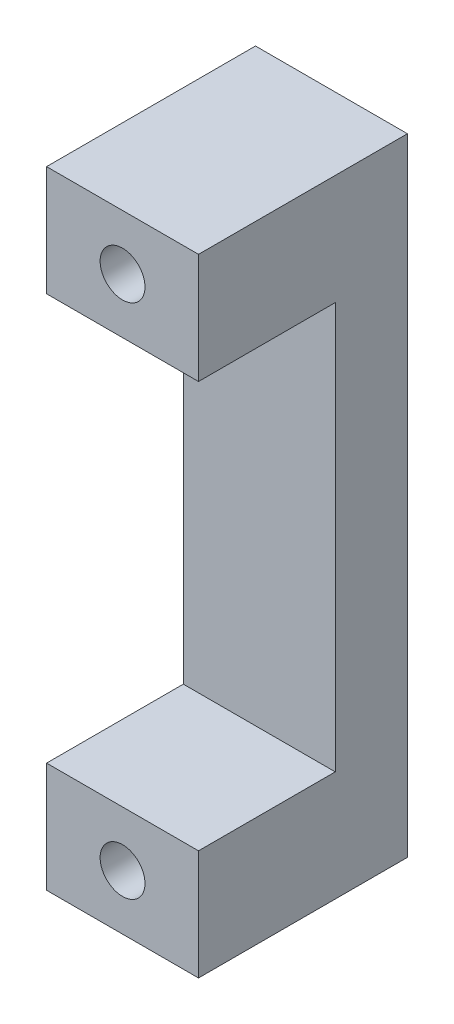
ISO-10303-21;
HEADER;
FILE_DESCRIPTION(('STEP AP214'),'2;1');
FILE_NAME('part.step','',(''),(''),'','','');
FILE_SCHEMA(('AUTOMOTIVE_DESIGN { 1 0 10303 214 1 1 1 1 }'));
ENDSEC;
DATA;
#1=APPLICATION_CONTEXT('core data for automotive mechanical design processes');
#2=APPLICATION_PROTOCOL_DEFINITION('international standard','automotive_design',2000,#1);
#3=PRODUCT_CONTEXT('',#1,'mechanical');
#4=PRODUCT('Part','Part','',(#3));
#5=PRODUCT_RELATED_PRODUCT_CATEGORY('part','',(#4));
#6=PRODUCT_DEFINITION_FORMATION('','',#4);
#7=PRODUCT_DEFINITION_CONTEXT('part definition',#1,'design');
#8=PRODUCT_DEFINITION('design','',#6,#7);
#9=PRODUCT_DEFINITION_SHAPE('','',#8);
#10=(LENGTH_UNIT() NAMED_UNIT(*) SI_UNIT(.MILLI.,.METRE.));
#11=(NAMED_UNIT(*) PLANE_ANGLE_UNIT() SI_UNIT($,.RADIAN.));
#12=(NAMED_UNIT(*) SI_UNIT($,.STERADIAN.) SOLID_ANGLE_UNIT());
#13=UNCERTAINTY_MEASURE_WITH_UNIT(LENGTH_MEASURE(1.E-05),#10,'distance_accuracy_value','');
#14=(GEOMETRIC_REPRESENTATION_CONTEXT(3) GLOBAL_UNCERTAINTY_ASSIGNED_CONTEXT((#13)) GLOBAL_UNIT_ASSIGNED_CONTEXT((#10,
#11,#12)) REPRESENTATION_CONTEXT('',''));
#15=CARTESIAN_POINT('',(0.,0.,0.));
#16=DIRECTION('',(0.,0.,1.));
#17=DIRECTION('',(1.,0.,0.));
#18=AXIS2_PLACEMENT_3D('',#15,#16,#17);
#19=CARTESIAN_POINT('',(0.,0.,13.97));
#20=DIRECTION('',(0.,0.,-1.));
#21=DIRECTION('',(-1.,0.,0.));
#22=AXIS2_PLACEMENT_3D('',#19,#20,#21);
#23=PLANE('',#22);
#24=CARTESIAN_POINT('',(5.08,38.227,13.97));
#25=DIRECTION('',(0.,0.,1.));
#26=DIRECTION('',(1.,0.,0.));
#27=AXIS2_PLACEMENT_3D('',#24,#25,#26);
#28=CIRCLE('',#27,1.49999999999999);
#29=CARTESIAN_POINT('',(6.57999999999999,38.227,13.97));
#30=VERTEX_POINT('',#29);
#31=EDGE_CURVE('E210',#30,#30,#28,.T.);
#32=ORIENTED_EDGE('',*,*,#31,.F.);
#33=EDGE_LOOP('',(#32));
#34=FACE_BOUND('',#33,.T.);
#35=DIRECTION('',(0.,-1.,0.));
#36=VECTOR('',#35,1.);
#37=CARTESIAN_POINT('',(0.,0.,13.97));
#38=LINE('',#37,#36);
#39=CARTESIAN_POINT('',(0.,41.91,13.97));
#40=VERTEX_POINT('',#39);
#41=CARTESIAN_POINT('',(0.,34.544,13.97));
#42=VERTEX_POINT('',#41);
#43=EDGE_CURVE('E144',#40,#42,#38,.T.);
#44=ORIENTED_EDGE('',*,*,#43,.T.);
#45=DIRECTION('',(-1.,0.,0.));
#46=VECTOR('',#45,1.);
#47=CARTESIAN_POINT('',(0.,34.544,13.97));
#48=LINE('',#47,#46);
#49=CARTESIAN_POINT('',(10.16,34.544,13.97));
#50=VERTEX_POINT('',#49);
#51=EDGE_CURVE('E132',#50,#42,#48,.T.);
#52=ORIENTED_EDGE('',*,*,#51,.F.);
#53=DIRECTION('',(0.,1.,0.));
#54=VECTOR('',#53,1.);
#55=CARTESIAN_POINT('',(10.16,0.,13.97));
#56=LINE('',#55,#54);
#57=CARTESIAN_POINT('',(10.16,41.91,13.97));
#58=VERTEX_POINT('',#57);
#59=EDGE_CURVE('E150',#50,#58,#56,.T.);
#60=ORIENTED_EDGE('',*,*,#59,.T.);
#61=DIRECTION('',(-1.,0.,0.));
#62=VECTOR('',#61,1.);
#63=CARTESIAN_POINT('',(0.,41.91,13.97));
#64=LINE('',#63,#62);
#65=EDGE_CURVE('E64',#58,#40,#64,.T.);
#66=ORIENTED_EDGE('',*,*,#65,.T.);
#67=EDGE_LOOP('',(#44,#52,#60,#66));
#68=FACE_BOUND('',#67,.T.);
#69=ADVANCED_FACE('F39',(#34,#68),#23,.F.);
#70=CARTESIAN_POINT('',(0.,0.,13.97));
#71=DIRECTION('',(1.,0.,0.));
#72=DIRECTION('',(0.,1.,0.));
#73=AXIS2_PLACEMENT_3D('',#70,#71,#72);
#74=PLANE('',#73);
#75=DIRECTION('',(0.,-1.,0.));
#76=VECTOR('',#75,1.);
#77=CARTESIAN_POINT('',(0.,34.544,4.826));
#78=LINE('',#77,#76);
#79=CARTESIAN_POINT('',(0.,34.544,4.826));
#80=VERTEX_POINT('',#79);
#81=CARTESIAN_POINT('',(0.,7.366,4.826));
#82=VERTEX_POINT('',#81);
#83=EDGE_CURVE('E122',#80,#82,#78,.T.);
#84=ORIENTED_EDGE('',*,*,#83,.F.);
#85=DIRECTION('',(0.,0.,1.));
#86=VECTOR('',#85,1.);
#87=CARTESIAN_POINT('',(0.,34.544,4.826));
#88=LINE('',#87,#86);
#89=EDGE_CURVE('E163',#80,#42,#88,.T.);
#90=ORIENTED_EDGE('',*,*,#89,.T.);
#91=ORIENTED_EDGE('',*,*,#43,.F.);
#92=DIRECTION('',(0.,0.,-1.));
#93=VECTOR('',#92,1.);
#94=CARTESIAN_POINT('',(0.,41.91,13.97));
#95=LINE('',#94,#93);
#96=CARTESIAN_POINT('',(0.,41.91,0.));
#97=VERTEX_POINT('',#96);
#98=EDGE_CURVE('E157',#40,#97,#95,.T.);
#99=ORIENTED_EDGE('',*,*,#98,.T.);
#100=DIRECTION('',(0.,-1.,0.));
#101=VECTOR('',#100,1.);
#102=CARTESIAN_POINT('',(0.,0.,0.));
#103=LINE('',#102,#101);
#104=CARTESIAN_POINT('',(0.,0.,0.));
#105=VERTEX_POINT('',#104);
#106=EDGE_CURVE('E158',#97,#105,#103,.T.);
#107=ORIENTED_EDGE('',*,*,#106,.T.);
#108=DIRECTION('',(0.,0.,-1.));
#109=VECTOR('',#108,1.);
#110=CARTESIAN_POINT('',(0.,0.,13.97));
#111=LINE('',#110,#109);
#112=CARTESIAN_POINT('',(0.,0.,13.97));
#113=VERTEX_POINT('',#112);
#114=EDGE_CURVE('E11',#113,#105,#111,.T.);
#115=ORIENTED_EDGE('',*,*,#114,.F.);
#116=CARTESIAN_POINT('',(0.,7.366,13.97));
#117=VERTEX_POINT('',#116);
#118=EDGE_CURVE('E92',#117,#113,#38,.T.);
#119=ORIENTED_EDGE('',*,*,#118,.F.);
#120=DIRECTION('',(0.,0.,1.));
#121=VECTOR('',#120,1.);
#122=CARTESIAN_POINT('',(0.,7.366,4.826));
#123=LINE('',#122,#121);
#124=EDGE_CURVE('E55',#82,#117,#123,.T.);
#125=ORIENTED_EDGE('',*,*,#124,.F.);
#126=EDGE_LOOP('',(#84,#90,#91,#99,#107,#115,#119,#125));
#127=FACE_BOUND('',#126,.T.);
#128=ADVANCED_FACE('F41',(#127),#74,.F.);
#129=CARTESIAN_POINT('',(0.,0.,13.97));
#130=DIRECTION('',(0.,1.,0.));
#131=DIRECTION('',(0.,0.,1.));
#132=AXIS2_PLACEMENT_3D('',#129,#130,#131);
#133=PLANE('',#132);
#134=DIRECTION('',(1.,0.,0.));
#135=VECTOR('',#134,1.);
#136=CARTESIAN_POINT('',(0.,0.,0.));
#137=LINE('',#136,#135);
#138=CARTESIAN_POINT('',(10.16,0.,0.));
#139=VERTEX_POINT('',#138);
#140=EDGE_CURVE('E162',#105,#139,#137,.T.);
#141=ORIENTED_EDGE('',*,*,#140,.T.);
#142=DIRECTION('',(0.,0.,-1.));
#143=VECTOR('',#142,1.);
#144=CARTESIAN_POINT('',(10.16,0.,13.97));
#145=LINE('',#144,#143);
#146=CARTESIAN_POINT('',(10.16,0.,13.97));
#147=VERTEX_POINT('',#146);
#148=EDGE_CURVE('E48',#147,#139,#145,.T.);
#149=ORIENTED_EDGE('',*,*,#148,.F.);
#150=DIRECTION('',(1.,0.,0.));
#151=VECTOR('',#150,1.);
#152=CARTESIAN_POINT('',(0.,0.,13.97));
#153=LINE('',#152,#151);
#154=EDGE_CURVE('E147',#113,#147,#153,.T.);
#155=ORIENTED_EDGE('',*,*,#154,.F.);
#156=ORIENTED_EDGE('',*,*,#114,.T.);
#157=EDGE_LOOP('',(#141,#149,#155,#156));
#158=FACE_BOUND('',#157,.T.);
#159=ADVANCED_FACE('F229',(#158),#133,.F.);
#160=CARTESIAN_POINT('',(10.16,0.,13.97));
#161=DIRECTION('',(-1.,0.,0.));
#162=DIRECTION('',(0.,-1.,0.));
#163=AXIS2_PLACEMENT_3D('',#160,#161,#162);
#164=PLANE('',#163);
#165=ORIENTED_EDGE('',*,*,#59,.F.);
#166=DIRECTION('',(0.,0.,1.));
#167=VECTOR('',#166,1.);
#168=CARTESIAN_POINT('',(10.16,34.544,4.826));
#169=LINE('',#168,#167);
#170=CARTESIAN_POINT('',(10.16,34.544,4.826));
#171=VERTEX_POINT('',#170);
#172=EDGE_CURVE('E139',#171,#50,#169,.T.);
#173=ORIENTED_EDGE('',*,*,#172,.F.);
#174=DIRECTION('',(0.,1.,0.));
#175=VECTOR('',#174,1.);
#176=CARTESIAN_POINT('',(10.16,34.544,4.826));
#177=LINE('',#176,#175);
#178=CARTESIAN_POINT('',(10.16,7.366,4.826));
#179=VERTEX_POINT('',#178);
#180=EDGE_CURVE('E121',#179,#171,#177,.T.);
#181=ORIENTED_EDGE('',*,*,#180,.F.);
#182=DIRECTION('',(0.,0.,1.));
#183=VECTOR('',#182,1.);
#184=CARTESIAN_POINT('',(10.16,7.366,4.826));
#185=LINE('',#184,#183);
#186=CARTESIAN_POINT('',(10.16,7.366,13.97));
#187=VERTEX_POINT('',#186);
#188=EDGE_CURVE('E117',#179,#187,#185,.T.);
#189=ORIENTED_EDGE('',*,*,#188,.T.);
#190=EDGE_CURVE('E151',#147,#187,#56,.T.);
#191=ORIENTED_EDGE('',*,*,#190,.F.);
#192=ORIENTED_EDGE('',*,*,#148,.T.);
#193=DIRECTION('',(0.,1.,0.));
#194=VECTOR('',#193,1.);
#195=CARTESIAN_POINT('',(10.16,0.,0.));
#196=LINE('',#195,#194);
#197=CARTESIAN_POINT('',(10.16,41.91,0.));
#198=VERTEX_POINT('',#197);
#199=EDGE_CURVE('E166',#139,#198,#196,.T.);
#200=ORIENTED_EDGE('',*,*,#199,.T.);
#201=DIRECTION('',(0.,0.,-1.));
#202=VECTOR('',#201,1.);
#203=CARTESIAN_POINT('',(10.16,41.91,13.97));
#204=LINE('',#203,#202);
#205=EDGE_CURVE('E173',#58,#198,#204,.T.);
#206=ORIENTED_EDGE('',*,*,#205,.F.);
#207=EDGE_LOOP('',(#165,#173,#181,#189,#191,#192,#200,#206));
#208=FACE_BOUND('',#207,.T.);
#209=ADVANCED_FACE('F182',(#208),#164,.F.);
#210=CARTESIAN_POINT('',(0.,41.91,13.97));
#211=DIRECTION('',(0.,-1.,0.));
#212=DIRECTION('',(0.,0.,-1.));
#213=AXIS2_PLACEMENT_3D('',#210,#211,#212);
#214=PLANE('',#213);
#215=DIRECTION('',(-1.,0.,0.));
#216=VECTOR('',#215,1.);
#217=CARTESIAN_POINT('',(0.,41.91,0.));
#218=LINE('',#217,#216);
#219=EDGE_CURVE('E85',#198,#97,#218,.T.);
#220=ORIENTED_EDGE('',*,*,#219,.T.);
#221=ORIENTED_EDGE('',*,*,#98,.F.);
#222=ORIENTED_EDGE('',*,*,#65,.F.);
#223=ORIENTED_EDGE('',*,*,#205,.T.);
#224=EDGE_LOOP('',(#220,#221,#222,#223));
#225=FACE_BOUND('',#224,.T.);
#226=ADVANCED_FACE('F189',(#225),#214,.F.);
#227=CARTESIAN_POINT('',(5.08,3.683,13.97));
#228=DIRECTION('',(0.,0.,1.));
#229=DIRECTION('',(1.,0.,0.));
#230=AXIS2_PLACEMENT_3D('',#227,#228,#229);
#231=CIRCLE('',#230,1.49999999999999);
#232=CARTESIAN_POINT('',(6.57999999999999,3.683,13.97));
#233=VERTEX_POINT('',#232);
#234=EDGE_CURVE('E218',#233,#233,#231,.T.);
#235=ORIENTED_EDGE('',*,*,#234,.F.);
#236=EDGE_LOOP('',(#235));
#237=FACE_BOUND('',#236,.T.);
#238=ORIENTED_EDGE('',*,*,#190,.T.);
#239=DIRECTION('',(1.,0.,0.));
#240=VECTOR('',#239,1.);
#241=CARTESIAN_POINT('',(0.,7.366,13.97));
#242=LINE('',#241,#240);
#243=EDGE_CURVE('E201',#117,#187,#242,.T.);
#244=ORIENTED_EDGE('',*,*,#243,.F.);
#245=ORIENTED_EDGE('',*,*,#118,.T.);
#246=ORIENTED_EDGE('',*,*,#154,.T.);
#247=EDGE_LOOP('',(#238,#244,#245,#246));
#248=FACE_BOUND('',#247,.T.);
#249=ADVANCED_FACE('F226',(#237,#248),#23,.F.);
#250=CARTESIAN_POINT('',(0.,0.,0.));
#251=DIRECTION('',(0.,0.,-1.));
#252=DIRECTION('',(-1.,0.,0.));
#253=AXIS2_PLACEMENT_3D('',#250,#251,#252);
#254=PLANE('',#253);
#255=CARTESIAN_POINT('',(5.08,3.683,0.));
#256=DIRECTION('',(0.,0.,-1.));
#257=DIRECTION('',(-1.,0.,0.));
#258=AXIS2_PLACEMENT_3D('',#255,#256,#257);
#259=CIRCLE('',#258,1.49999999999999);
#260=CARTESIAN_POINT('',(3.58000000000001,3.683,0.));
#261=VERTEX_POINT('',#260);
#262=EDGE_CURVE('E214',#261,#261,#259,.T.);
#263=ORIENTED_EDGE('',*,*,#262,.F.);
#264=EDGE_LOOP('',(#263));
#265=FACE_BOUND('',#264,.T.);
#266=CARTESIAN_POINT('',(5.08,38.227,0.));
#267=DIRECTION('',(0.,0.,-1.));
#268=DIRECTION('',(-1.,0.,0.));
#269=AXIS2_PLACEMENT_3D('',#266,#267,#268);
#270=CIRCLE('',#269,1.49999999999999);
#271=CARTESIAN_POINT('',(3.58000000000001,38.227,0.));
#272=VERTEX_POINT('',#271);
#273=EDGE_CURVE('E203',#272,#272,#270,.T.);
#274=ORIENTED_EDGE('',*,*,#273,.F.);
#275=EDGE_LOOP('',(#274));
#276=FACE_BOUND('',#275,.T.);
#277=ORIENTED_EDGE('',*,*,#106,.F.);
#278=ORIENTED_EDGE('',*,*,#219,.F.);
#279=ORIENTED_EDGE('',*,*,#199,.F.);
#280=ORIENTED_EDGE('',*,*,#140,.F.);
#281=EDGE_LOOP('',(#277,#278,#279,#280));
#282=FACE_BOUND('',#281,.T.);
#283=ADVANCED_FACE('F187',(#265,#276,#282),#254,.T.);
#284=CARTESIAN_POINT('',(0.,34.544,4.826));
#285=DIRECTION('',(0.,1.,0.));
#286=DIRECTION('',(0.,0.,1.));
#287=AXIS2_PLACEMENT_3D('',#284,#285,#286);
#288=PLANE('',#287);
#289=ORIENTED_EDGE('',*,*,#51,.T.);
#290=ORIENTED_EDGE('',*,*,#89,.F.);
#291=DIRECTION('',(-1.,0.,0.));
#292=VECTOR('',#291,1.);
#293=CARTESIAN_POINT('',(0.,34.544,4.826));
#294=LINE('',#293,#292);
#295=EDGE_CURVE('E128',#171,#80,#294,.T.);
#296=ORIENTED_EDGE('',*,*,#295,.F.);
#297=ORIENTED_EDGE('',*,*,#172,.T.);
#298=EDGE_LOOP('',(#289,#290,#296,#297));
#299=FACE_BOUND('',#298,.T.);
#300=ADVANCED_FACE('F246',(#299),#288,.F.);
#301=CARTESIAN_POINT('',(0.,7.366,4.826));
#302=DIRECTION('',(0.,-1.,0.));
#303=DIRECTION('',(0.,0.,-1.));
#304=AXIS2_PLACEMENT_3D('',#301,#302,#303);
#305=PLANE('',#304);
#306=ORIENTED_EDGE('',*,*,#243,.T.);
#307=ORIENTED_EDGE('',*,*,#188,.F.);
#308=DIRECTION('',(1.,0.,0.));
#309=VECTOR('',#308,1.);
#310=CARTESIAN_POINT('',(0.,7.366,4.826));
#311=LINE('',#310,#309);
#312=EDGE_CURVE('E113',#82,#179,#311,.T.);
#313=ORIENTED_EDGE('',*,*,#312,.F.);
#314=ORIENTED_EDGE('',*,*,#124,.T.);
#315=EDGE_LOOP('',(#306,#307,#313,#314));
#316=FACE_BOUND('',#315,.T.);
#317=ADVANCED_FACE('F115',(#316),#305,.F.);
#318=CARTESIAN_POINT('',(0.,0.,4.826));
#319=DIRECTION('',(0.,0.,1.));
#320=DIRECTION('',(1.,0.,0.));
#321=AXIS2_PLACEMENT_3D('',#318,#319,#320);
#322=PLANE('',#321);
#323=ORIENTED_EDGE('',*,*,#83,.T.);
#324=ORIENTED_EDGE('',*,*,#312,.T.);
#325=ORIENTED_EDGE('',*,*,#180,.T.);
#326=ORIENTED_EDGE('',*,*,#295,.T.);
#327=EDGE_LOOP('',(#323,#324,#325,#326));
#328=FACE_BOUND('',#327,.T.);
#329=ADVANCED_FACE('F126',(#328),#322,.T.);
#330=CARTESIAN_POINT('',(5.08,38.227,13.97));
#331=DIRECTION('',(0.,0.,1.));
#332=DIRECTION('',(1.,0.,0.));
#333=AXIS2_PLACEMENT_3D('',#330,#331,#332);
#334=CYLINDRICAL_SURFACE('',#333,1.49999999999999);
#335=ORIENTED_EDGE('',*,*,#31,.T.);
#336=EDGE_LOOP('',(#335));
#337=FACE_BOUND('',#336,.T.);
#338=ORIENTED_EDGE('',*,*,#273,.T.);
#339=EDGE_LOOP('',(#338));
#340=FACE_BOUND('',#339,.T.);
#341=ADVANCED_FACE('F279',(#337,#340),#334,.F.);
#342=CARTESIAN_POINT('',(5.08,3.683,13.97));
#343=DIRECTION('',(0.,0.,1.));
#344=DIRECTION('',(1.,0.,0.));
#345=AXIS2_PLACEMENT_3D('',#342,#343,#344);
#346=CYLINDRICAL_SURFACE('',#345,1.49999999999999);
#347=ORIENTED_EDGE('',*,*,#234,.T.);
#348=EDGE_LOOP('',(#347));
#349=FACE_BOUND('',#348,.T.);
#350=ORIENTED_EDGE('',*,*,#262,.T.);
#351=EDGE_LOOP('',(#350));
#352=FACE_BOUND('',#351,.T.);
#353=ADVANCED_FACE('F223',(#349,#352),#346,.F.);
#354=CLOSED_SHELL('',(#69,#128,#159,#209,#226,#249,#283,#300,#317,#329,#341,#353));
#355=MANIFOLD_SOLID_BREP('B2',#354);
#356=ADVANCED_BREP_SHAPE_REPRESENTATION('',(#18,#355),#14);
#357=SHAPE_DEFINITION_REPRESENTATION(#9,#356);
ENDSEC;
END-ISO-10303-21;
